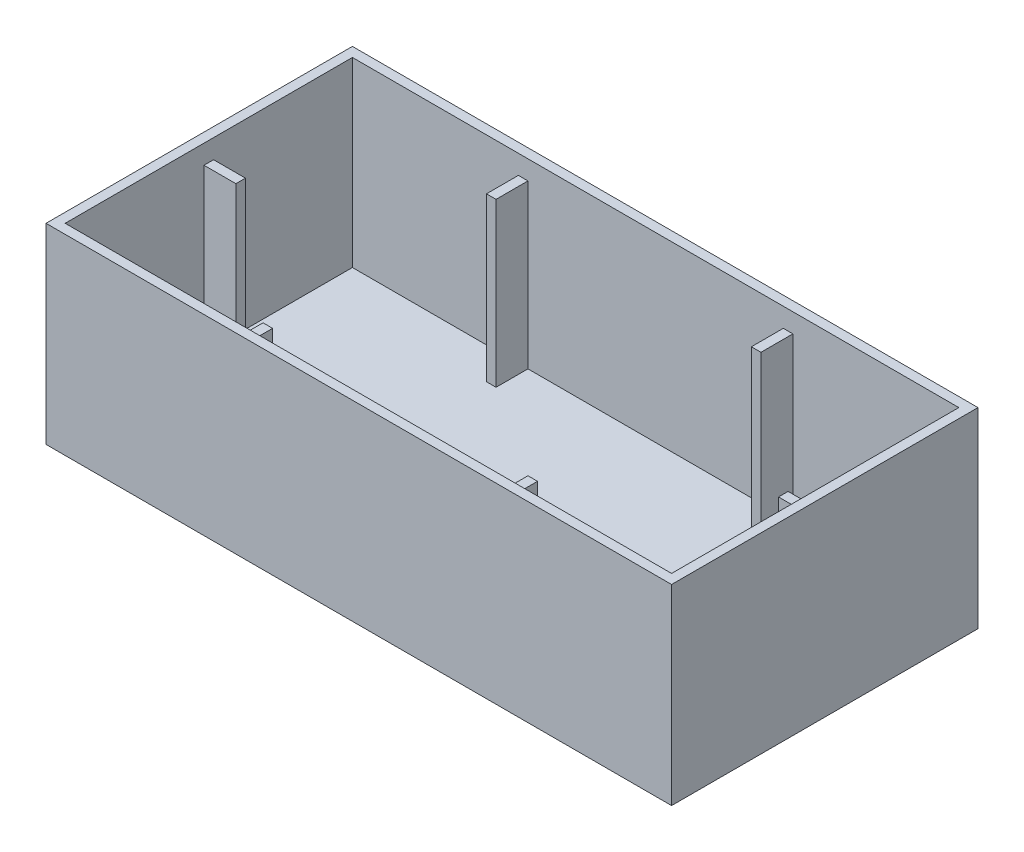
ISO-10303-21;
HEADER;
FILE_DESCRIPTION(('STEP AP214'),'2;1');
FILE_NAME('part.step','',(''),(''),'','','');
FILE_SCHEMA(('AUTOMOTIVE_DESIGN { 1 0 10303 214 1 1 1 1 }'));
ENDSEC;
DATA;
#1=APPLICATION_CONTEXT('core data for automotive mechanical design processes');
#2=APPLICATION_PROTOCOL_DEFINITION('international standard','automotive_design',2000,#1);
#3=PRODUCT_CONTEXT('',#1,'mechanical');
#4=PRODUCT('Part','Part','',(#3));
#5=PRODUCT_RELATED_PRODUCT_CATEGORY('part','',(#4));
#6=PRODUCT_DEFINITION_FORMATION('','',#4);
#7=PRODUCT_DEFINITION_CONTEXT('part definition',#1,'design');
#8=PRODUCT_DEFINITION('design','',#6,#7);
#9=PRODUCT_DEFINITION_SHAPE('','',#8);
#10=(LENGTH_UNIT() NAMED_UNIT(*) SI_UNIT(.MILLI.,.METRE.));
#11=(NAMED_UNIT(*) PLANE_ANGLE_UNIT() SI_UNIT($,.RADIAN.));
#12=(NAMED_UNIT(*) SI_UNIT($,.STERADIAN.) SOLID_ANGLE_UNIT());
#13=UNCERTAINTY_MEASURE_WITH_UNIT(LENGTH_MEASURE(1.E-05),#10,'distance_accuracy_value','');
#14=(GEOMETRIC_REPRESENTATION_CONTEXT(3) GLOBAL_UNCERTAINTY_ASSIGNED_CONTEXT((#13)) GLOBAL_UNIT_ASSIGNED_CONTEXT((#10,
#11,#12)) REPRESENTATION_CONTEXT('',''));
#15=CARTESIAN_POINT('',(0.,0.,0.));
#16=DIRECTION('',(0.,0.,1.));
#17=DIRECTION('',(1.,0.,0.));
#18=AXIS2_PLACEMENT_3D('',#15,#16,#17);
#19=CARTESIAN_POINT('',(0.,1.5,0.));
#20=DIRECTION('',(0.,-1.,0.));
#21=DIRECTION('',(0.,0.,-1.));
#22=AXIS2_PLACEMENT_3D('',#19,#20,#21);
#23=PLANE('',#22);
#24=DIRECTION('',(-1.,0.,0.));
#25=VECTOR('',#24,1.);
#26=CARTESIAN_POINT('',(-47.5,1.5,-0.750000000000003));
#27=LINE('',#26,#25);
#28=CARTESIAN_POINT('',(-42.5,1.5,-0.74999999999999));
#29=VERTEX_POINT('',#28);
#30=CARTESIAN_POINT('',(-47.5,1.5,-0.750000000000003));
#31=VERTEX_POINT('',#30);
#32=EDGE_CURVE('E806',#29,#31,#27,.T.);
#33=ORIENTED_EDGE('',*,*,#32,.F.);
#34=DIRECTION('',(0.,0.,-1.));
#35=VECTOR('',#34,1.);
#36=CARTESIAN_POINT('',(-42.5,1.5,-0.74999999999999));
#37=LINE('',#36,#35);
#38=CARTESIAN_POINT('',(-42.5,1.5,0.75000000000001));
#39=VERTEX_POINT('',#38);
#40=EDGE_CURVE('E266',#39,#29,#37,.T.);
#41=ORIENTED_EDGE('',*,*,#40,.F.);
#42=DIRECTION('',(1.,0.,0.));
#43=VECTOR('',#42,1.);
#44=CARTESIAN_POINT('',(-47.5,1.5,0.750000000000019));
#45=LINE('',#44,#43);
#46=CARTESIAN_POINT('',(-47.5,1.5,0.750000000000019));
#47=VERTEX_POINT('',#46);
#48=EDGE_CURVE('E251',#47,#39,#45,.T.);
#49=ORIENTED_EDGE('',*,*,#48,.F.);
#50=DIRECTION('',(0.,0.,1.));
#51=VECTOR('',#50,1.);
#52=CARTESIAN_POINT('',(-47.5,1.5,0.));
#53=LINE('',#52,#51);
#54=CARTESIAN_POINT('',(-47.5,1.5,22.5));
#55=VERTEX_POINT('',#54);
#56=EDGE_CURVE('E263',#47,#55,#53,.T.);
#57=ORIENTED_EDGE('',*,*,#56,.T.);
#58=DIRECTION('',(1.,0.,0.));
#59=VECTOR('',#58,1.);
#60=CARTESIAN_POINT('',(0.,1.5,22.5));
#61=LINE('',#60,#59);
#62=CARTESIAN_POINT('',(-21.5,1.5,22.5));
#63=VERTEX_POINT('',#62);
#64=EDGE_CURVE('E285',#55,#63,#61,.T.);
#65=ORIENTED_EDGE('',*,*,#64,.T.);
#66=DIRECTION('',(0.,0.,1.));
#67=VECTOR('',#66,1.);
#68=CARTESIAN_POINT('',(-21.5,1.5,22.5));
#69=LINE('',#68,#67);
#70=CARTESIAN_POINT('',(-21.5,1.5,17.5));
#71=VERTEX_POINT('',#70);
#72=EDGE_CURVE('E858',#71,#63,#69,.T.);
#73=ORIENTED_EDGE('',*,*,#72,.F.);
#74=DIRECTION('',(-1.,0.,0.));
#75=VECTOR('',#74,1.);
#76=CARTESIAN_POINT('',(-21.5,1.5,17.5));
#77=LINE('',#76,#75);
#78=CARTESIAN_POINT('',(-20.,1.5,17.5));
#79=VERTEX_POINT('',#78);
#80=EDGE_CURVE('E855',#79,#71,#77,.T.);
#81=ORIENTED_EDGE('',*,*,#80,.F.);
#82=DIRECTION('',(0.,0.,-1.));
#83=VECTOR('',#82,1.);
#84=CARTESIAN_POINT('',(-20.,1.5,22.5));
#85=LINE('',#84,#83);
#86=CARTESIAN_POINT('',(-20.,1.5,22.5));
#87=VERTEX_POINT('',#86);
#88=EDGE_CURVE('E756',#87,#79,#85,.T.);
#89=ORIENTED_EDGE('',*,*,#88,.F.);
#90=CARTESIAN_POINT('',(20.,1.5,22.5));
#91=VERTEX_POINT('',#90);
#92=EDGE_CURVE('E288',#87,#91,#61,.T.);
#93=ORIENTED_EDGE('',*,*,#92,.T.);
#94=DIRECTION('',(0.,0.,1.));
#95=VECTOR('',#94,1.);
#96=CARTESIAN_POINT('',(20.,1.5,22.5));
#97=LINE('',#96,#95);
#98=CARTESIAN_POINT('',(20.,1.5,17.5));
#99=VERTEX_POINT('',#98);
#100=EDGE_CURVE('E753',#99,#91,#97,.T.);
#101=ORIENTED_EDGE('',*,*,#100,.F.);
#102=DIRECTION('',(-1.,0.,0.));
#103=VECTOR('',#102,1.);
#104=CARTESIAN_POINT('',(21.5,1.5,17.5));
#105=LINE('',#104,#103);
#106=CARTESIAN_POINT('',(21.5,1.5,17.5));
#107=VERTEX_POINT('',#106);
#108=EDGE_CURVE('E765',#107,#99,#105,.T.);
#109=ORIENTED_EDGE('',*,*,#108,.F.);
#110=DIRECTION('',(0.,0.,-1.));
#111=VECTOR('',#110,1.);
#112=CARTESIAN_POINT('',(21.5,1.5,22.5));
#113=LINE('',#112,#111);
#114=CARTESIAN_POINT('',(21.5,1.5,22.5));
#115=VERTEX_POINT('',#114);
#116=EDGE_CURVE('E748',#115,#107,#113,.T.);
#117=ORIENTED_EDGE('',*,*,#116,.F.);
#118=CARTESIAN_POINT('',(47.5,1.5,22.5));
#119=VERTEX_POINT('',#118);
#120=EDGE_CURVE('E276',#115,#119,#61,.T.);
#121=ORIENTED_EDGE('',*,*,#120,.T.);
#122=DIRECTION('',(0.,0.,-1.));
#123=VECTOR('',#122,1.);
#124=CARTESIAN_POINT('',(47.5,1.5,0.));
#125=LINE('',#124,#123);
#126=CARTESIAN_POINT('',(47.5,1.5,0.750000000000019));
#127=VERTEX_POINT('',#126);
#128=EDGE_CURVE('E728',#119,#127,#125,.T.);
#129=ORIENTED_EDGE('',*,*,#128,.T.);
#130=DIRECTION('',(1.,0.,0.));
#131=VECTOR('',#130,1.);
#132=CARTESIAN_POINT('',(47.5,1.5,0.750000000000019));
#133=LINE('',#132,#131);
#134=CARTESIAN_POINT('',(42.5,1.5,0.75000000000001));
#135=VERTEX_POINT('',#134);
#136=EDGE_CURVE('E744',#135,#127,#133,.T.);
#137=ORIENTED_EDGE('',*,*,#136,.F.);
#138=DIRECTION('',(0.,0.,1.));
#139=VECTOR('',#138,1.);
#140=CARTESIAN_POINT('',(42.5,1.5,-0.74999999999999));
#141=LINE('',#140,#139);
#142=CARTESIAN_POINT('',(42.5,1.5,-0.74999999999999));
#143=VERTEX_POINT('',#142);
#144=EDGE_CURVE('E832',#143,#135,#141,.T.);
#145=ORIENTED_EDGE('',*,*,#144,.F.);
#146=DIRECTION('',(-1.,0.,0.));
#147=VECTOR('',#146,1.);
#148=CARTESIAN_POINT('',(47.5,1.5,-0.750000000000003));
#149=LINE('',#148,#147);
#150=CARTESIAN_POINT('',(47.5,1.5,-0.750000000000003));
#151=VERTEX_POINT('',#150);
#152=EDGE_CURVE('E829',#151,#143,#149,.T.);
#153=ORIENTED_EDGE('',*,*,#152,.F.);
#154=CARTESIAN_POINT('',(47.5,1.5,-22.5));
#155=VERTEX_POINT('',#154);
#156=EDGE_CURVE('E707',#151,#155,#125,.T.);
#157=ORIENTED_EDGE('',*,*,#156,.T.);
#158=DIRECTION('',(-1.,0.,0.));
#159=VECTOR('',#158,1.);
#160=CARTESIAN_POINT('',(0.,1.5,-22.5));
#161=LINE('',#160,#159);
#162=CARTESIAN_POINT('',(21.5,1.5,-22.5));
#163=VERTEX_POINT('',#162);
#164=EDGE_CURVE('E273',#155,#163,#161,.T.);
#165=ORIENTED_EDGE('',*,*,#164,.T.);
#166=DIRECTION('',(0.,0.,-1.));
#167=VECTOR('',#166,1.);
#168=CARTESIAN_POINT('',(21.5,1.5,-22.5));
#169=LINE('',#168,#167);
#170=CARTESIAN_POINT('',(21.5,1.5,-17.5));
#171=VERTEX_POINT('',#170);
#172=EDGE_CURVE('E785',#171,#163,#169,.T.);
#173=ORIENTED_EDGE('',*,*,#172,.F.);
#174=DIRECTION('',(1.,0.,0.));
#175=VECTOR('',#174,1.);
#176=CARTESIAN_POINT('',(21.5,1.5,-17.5));
#177=LINE('',#176,#175);
#178=CARTESIAN_POINT('',(20.,1.5,-17.5));
#179=VERTEX_POINT('',#178);
#180=EDGE_CURVE('E789',#179,#171,#177,.T.);
#181=ORIENTED_EDGE('',*,*,#180,.F.);
#182=DIRECTION('',(0.,0.,1.));
#183=VECTOR('',#182,1.);
#184=CARTESIAN_POINT('',(20.,1.5,-22.5));
#185=LINE('',#184,#183);
#186=CARTESIAN_POINT('',(20.,1.5,-22.5));
#187=VERTEX_POINT('',#186);
#188=EDGE_CURVE('E682',#187,#179,#185,.T.);
#189=ORIENTED_EDGE('',*,*,#188,.F.);
#190=CARTESIAN_POINT('',(-20.,1.5,-22.5));
#191=VERTEX_POINT('',#190);
#192=EDGE_CURVE('E277',#187,#191,#161,.T.);
#193=ORIENTED_EDGE('',*,*,#192,.T.);
#194=DIRECTION('',(0.,0.,-1.));
#195=VECTOR('',#194,1.);
#196=CARTESIAN_POINT('',(-20.,1.5,-22.5));
#197=LINE('',#196,#195);
#198=CARTESIAN_POINT('',(-20.,1.5,-17.5));
#199=VERTEX_POINT('',#198);
#200=EDGE_CURVE('E715',#199,#191,#197,.T.);
#201=ORIENTED_EDGE('',*,*,#200,.F.);
#202=DIRECTION('',(1.,0.,0.));
#203=VECTOR('',#202,1.);
#204=CARTESIAN_POINT('',(-21.5,1.5,-17.5));
#205=LINE('',#204,#203);
#206=CARTESIAN_POINT('',(-21.5,1.5,-17.5));
#207=VERTEX_POINT('',#206);
#208=EDGE_CURVE('E711',#207,#199,#205,.T.);
#209=ORIENTED_EDGE('',*,*,#208,.F.);
#210=DIRECTION('',(0.,0.,1.));
#211=VECTOR('',#210,1.);
#212=CARTESIAN_POINT('',(-21.5,1.5,-22.5));
#213=LINE('',#212,#211);
#214=CARTESIAN_POINT('',(-21.5,1.5,-22.5));
#215=VERTEX_POINT('',#214);
#216=EDGE_CURVE('E708',#215,#207,#213,.T.);
#217=ORIENTED_EDGE('',*,*,#216,.F.);
#218=CARTESIAN_POINT('',(-47.5,1.5,-22.5));
#219=VERTEX_POINT('',#218);
#220=EDGE_CURVE('E279',#215,#219,#161,.T.);
#221=ORIENTED_EDGE('',*,*,#220,.T.);
#222=EDGE_CURVE('E272',#219,#31,#53,.T.);
#223=ORIENTED_EDGE('',*,*,#222,.T.);
#224=EDGE_LOOP('',(#33,#41,#49,#57,#65,#73,#81,#89,#93,#101,#109,#117,#121,#129,#137,#145,#153,
#157,#165,#173,#181,#189,#193,#201,#209,#217,#221,#223));
#225=FACE_BOUND('',#224,.T.);
#226=ADVANCED_FACE('F35',(#225),#23,.F.);
#227=CARTESIAN_POINT('',(-47.5,30.,24.));
#228=DIRECTION('',(1.,0.,0.));
#229=DIRECTION('',(0.,0.,-1.));
#230=AXIS2_PLACEMENT_3D('',#227,#228,#229);
#231=PLANE('',#230);
#232=DIRECTION('',(0.,0.,-1.));
#233=VECTOR('',#232,1.);
#234=CARTESIAN_POINT('',(-47.5,27.,-0.750000000000003));
#235=LINE('',#234,#233);
#236=CARTESIAN_POINT('',(-47.5,27.,0.750000000000019));
#237=VERTEX_POINT('',#236);
#238=CARTESIAN_POINT('',(-47.5,27.,-0.750000000000001));
#239=VERTEX_POINT('',#238);
#240=EDGE_CURVE('E833',#237,#239,#235,.T.);
#241=ORIENTED_EDGE('',*,*,#240,.T.);
#242=DIRECTION('',(0.,-1.,0.));
#243=VECTOR('',#242,1.);
#244=CARTESIAN_POINT('',(-47.5,35.2201532544553,-0.750000000000003));
#245=LINE('',#244,#243);
#246=EDGE_CURVE('E50',#239,#31,#245,.T.);
#247=ORIENTED_EDGE('',*,*,#246,.T.);
#248=ORIENTED_EDGE('',*,*,#222,.F.);
#249=DIRECTION('',(0.,-1.,0.));
#250=VECTOR('',#249,1.);
#251=CARTESIAN_POINT('',(-47.5,30.,-22.5));
#252=LINE('',#251,#250);
#253=CARTESIAN_POINT('',(-47.5,30.,-22.5));
#254=VERTEX_POINT('',#253);
#255=EDGE_CURVE('E282',#254,#219,#252,.T.);
#256=ORIENTED_EDGE('',*,*,#255,.F.);
#257=DIRECTION('',(0.,0.,1.));
#258=VECTOR('',#257,1.);
#259=CARTESIAN_POINT('',(-47.5,30.,0.));
#260=LINE('',#259,#258);
#261=CARTESIAN_POINT('',(-47.5,30.,22.5));
#262=VERTEX_POINT('',#261);
#263=EDGE_CURVE('E292',#254,#262,#260,.T.);
#264=ORIENTED_EDGE('',*,*,#263,.T.);
#265=DIRECTION('',(0.,-1.,0.));
#266=VECTOR('',#265,1.);
#267=CARTESIAN_POINT('',(-47.5,30.,22.5));
#268=LINE('',#267,#266);
#269=EDGE_CURVE('E270',#262,#55,#268,.T.);
#270=ORIENTED_EDGE('',*,*,#269,.T.);
#271=ORIENTED_EDGE('',*,*,#56,.F.);
#272=DIRECTION('',(0.,-1.,0.));
#273=VECTOR('',#272,1.);
#274=CARTESIAN_POINT('',(-47.5,35.2201532544553,0.750000000000019));
#275=LINE('',#274,#273);
#276=EDGE_CURVE('E247',#237,#47,#275,.T.);
#277=ORIENTED_EDGE('',*,*,#276,.F.);
#278=EDGE_LOOP('',(#241,#247,#248,#256,#264,#270,#271,#277));
#279=FACE_BOUND('',#278,.T.);
#280=ADVANCED_FACE('F268',(#279),#231,.T.);
#281=CARTESIAN_POINT('',(47.5,30.,24.));
#282=DIRECTION('',(-1.,0.,0.));
#283=DIRECTION('',(0.,0.,1.));
#284=AXIS2_PLACEMENT_3D('',#281,#282,#283);
#285=PLANE('',#284);
#286=DIRECTION('',(0.,0.,1.));
#287=VECTOR('',#286,1.);
#288=CARTESIAN_POINT('',(47.5,27.,-0.750000000000003));
#289=LINE('',#288,#287);
#290=CARTESIAN_POINT('',(47.5,27.,-0.750000000000003));
#291=VERTEX_POINT('',#290);
#292=CARTESIAN_POINT('',(47.5,27.,0.750000000000018));
#293=VERTEX_POINT('',#292);
#294=EDGE_CURVE('E823',#291,#293,#289,.T.);
#295=ORIENTED_EDGE('',*,*,#294,.T.);
#296=DIRECTION('',(0.,-1.,0.));
#297=VECTOR('',#296,1.);
#298=CARTESIAN_POINT('',(47.5,35.2201532544553,0.750000000000019));
#299=LINE('',#298,#297);
#300=EDGE_CURVE('E58',#293,#127,#299,.T.);
#301=ORIENTED_EDGE('',*,*,#300,.T.);
#302=ORIENTED_EDGE('',*,*,#128,.F.);
#303=DIRECTION('',(0.,-1.,0.));
#304=VECTOR('',#303,1.);
#305=CARTESIAN_POINT('',(47.5,30.,22.5));
#306=LINE('',#305,#304);
#307=CARTESIAN_POINT('',(47.5,30.,22.5));
#308=VERTEX_POINT('',#307);
#309=EDGE_CURVE('E284',#308,#119,#306,.T.);
#310=ORIENTED_EDGE('',*,*,#309,.F.);
#311=DIRECTION('',(0.,0.,-1.));
#312=VECTOR('',#311,1.);
#313=CARTESIAN_POINT('',(47.5,30.,0.));
#314=LINE('',#313,#312);
#315=CARTESIAN_POINT('',(47.5,30.,-22.5));
#316=VERTEX_POINT('',#315);
#317=EDGE_CURVE('E287',#308,#316,#314,.T.);
#318=ORIENTED_EDGE('',*,*,#317,.T.);
#319=DIRECTION('',(0.,-1.,0.));
#320=VECTOR('',#319,1.);
#321=CARTESIAN_POINT('',(47.5,30.,-22.5));
#322=LINE('',#321,#320);
#323=EDGE_CURVE('E311',#316,#155,#322,.T.);
#324=ORIENTED_EDGE('',*,*,#323,.T.);
#325=ORIENTED_EDGE('',*,*,#156,.F.);
#326=DIRECTION('',(0.,-1.,0.));
#327=VECTOR('',#326,1.);
#328=CARTESIAN_POINT('',(47.5,35.2201532544553,-0.750000000000003));
#329=LINE('',#328,#327);
#330=EDGE_CURVE('E837',#291,#151,#329,.T.);
#331=ORIENTED_EDGE('',*,*,#330,.F.);
#332=EDGE_LOOP('',(#295,#301,#302,#310,#318,#324,#325,#331));
#333=FACE_BOUND('',#332,.T.);
#334=ADVANCED_FACE('F354',(#333),#285,.T.);
#335=CARTESIAN_POINT('',(-49.,30.,22.5));
#336=DIRECTION('',(0.,0.,-1.));
#337=DIRECTION('',(-1.,0.,0.));
#338=AXIS2_PLACEMENT_3D('',#335,#336,#337);
#339=PLANE('',#338);
#340=DIRECTION('',(-1.,0.,0.));
#341=VECTOR('',#340,1.);
#342=CARTESIAN_POINT('',(-21.5,27.,22.5));
#343=LINE('',#342,#341);
#344=CARTESIAN_POINT('',(-20.,27.,22.5));
#345=VERTEX_POINT('',#344);
#346=CARTESIAN_POINT('',(-21.5,27.,22.5));
#347=VERTEX_POINT('',#346);
#348=EDGE_CURVE('E852',#345,#347,#343,.T.);
#349=ORIENTED_EDGE('',*,*,#348,.T.);
#350=DIRECTION('',(0.,-1.,0.));
#351=VECTOR('',#350,1.);
#352=CARTESIAN_POINT('',(-21.5,35.2201532544553,22.5));
#353=LINE('',#352,#351);
#354=EDGE_CURVE('E860',#347,#63,#353,.T.);
#355=ORIENTED_EDGE('',*,*,#354,.T.);
#356=ORIENTED_EDGE('',*,*,#64,.F.);
#357=ORIENTED_EDGE('',*,*,#269,.F.);
#358=DIRECTION('',(1.,0.,0.));
#359=VECTOR('',#358,1.);
#360=CARTESIAN_POINT('',(0.,30.,22.5));
#361=LINE('',#360,#359);
#362=EDGE_CURVE('E294',#262,#308,#361,.T.);
#363=ORIENTED_EDGE('',*,*,#362,.T.);
#364=ORIENTED_EDGE('',*,*,#309,.T.);
#365=ORIENTED_EDGE('',*,*,#120,.F.);
#366=DIRECTION('',(0.,-1.,0.));
#367=VECTOR('',#366,1.);
#368=CARTESIAN_POINT('',(21.5,35.2201532544553,22.5));
#369=LINE('',#368,#367);
#370=CARTESIAN_POINT('',(21.5,27.,22.5));
#371=VERTEX_POINT('',#370);
#372=EDGE_CURVE('E775',#371,#115,#369,.T.);
#373=ORIENTED_EDGE('',*,*,#372,.F.);
#374=DIRECTION('',(-1.,0.,0.));
#375=VECTOR('',#374,1.);
#376=CARTESIAN_POINT('',(21.5,27.,22.5));
#377=LINE('',#376,#375);
#378=CARTESIAN_POINT('',(20.,27.,22.5));
#379=VERTEX_POINT('',#378);
#380=EDGE_CURVE('E768',#371,#379,#377,.T.);
#381=ORIENTED_EDGE('',*,*,#380,.T.);
#382=DIRECTION('',(0.,-1.,0.));
#383=VECTOR('',#382,1.);
#384=CARTESIAN_POINT('',(20.,35.2201532544553,22.5));
#385=LINE('',#384,#383);
#386=EDGE_CURVE('E760',#379,#91,#385,.T.);
#387=ORIENTED_EDGE('',*,*,#386,.T.);
#388=ORIENTED_EDGE('',*,*,#92,.F.);
#389=DIRECTION('',(0.,-1.,0.));
#390=VECTOR('',#389,1.);
#391=CARTESIAN_POINT('',(-20.,35.2201532544553,22.5));
#392=LINE('',#391,#390);
#393=EDGE_CURVE('E867',#345,#87,#392,.T.);
#394=ORIENTED_EDGE('',*,*,#393,.F.);
#395=EDGE_LOOP('',(#349,#355,#356,#357,#363,#364,#365,#373,#381,#387,#388,#394));
#396=FACE_BOUND('',#395,.T.);
#397=ADVANCED_FACE('F358',(#396),#339,.T.);
#398=CARTESIAN_POINT('',(-49.,30.,-22.5));
#399=DIRECTION('',(0.,0.,1.));
#400=DIRECTION('',(1.,0.,0.));
#401=AXIS2_PLACEMENT_3D('',#398,#399,#400);
#402=PLANE('',#401);
#403=ORIENTED_EDGE('',*,*,#192,.F.);
#404=DIRECTION('',(0.,-1.,0.));
#405=VECTOR('',#404,1.);
#406=CARTESIAN_POINT('',(20.,35.2201532544553,-22.5));
#407=LINE('',#406,#405);
#408=CARTESIAN_POINT('',(20.,27.,-22.5));
#409=VERTEX_POINT('',#408);
#410=EDGE_CURVE('E674',#409,#187,#407,.T.);
#411=ORIENTED_EDGE('',*,*,#410,.F.);
#412=DIRECTION('',(1.,0.,0.));
#413=VECTOR('',#412,1.);
#414=CARTESIAN_POINT('',(21.5,27.,-22.5));
#415=LINE('',#414,#413);
#416=CARTESIAN_POINT('',(21.5,27.,-22.5));
#417=VERTEX_POINT('',#416);
#418=EDGE_CURVE('E781',#409,#417,#415,.T.);
#419=ORIENTED_EDGE('',*,*,#418,.T.);
#420=DIRECTION('',(0.,-1.,0.));
#421=VECTOR('',#420,1.);
#422=CARTESIAN_POINT('',(21.5,35.2201532544553,-22.5));
#423=LINE('',#422,#421);
#424=EDGE_CURVE('E684',#417,#163,#423,.T.);
#425=ORIENTED_EDGE('',*,*,#424,.T.);
#426=ORIENTED_EDGE('',*,*,#164,.F.);
#427=ORIENTED_EDGE('',*,*,#323,.F.);
#428=DIRECTION('',(-1.,0.,0.));
#429=VECTOR('',#428,1.);
#430=CARTESIAN_POINT('',(0.,30.,-22.5));
#431=LINE('',#430,#429);
#432=EDGE_CURVE('E290',#316,#254,#431,.T.);
#433=ORIENTED_EDGE('',*,*,#432,.T.);
#434=ORIENTED_EDGE('',*,*,#255,.T.);
#435=ORIENTED_EDGE('',*,*,#220,.F.);
#436=DIRECTION('',(0.,-1.,0.));
#437=VECTOR('',#436,1.);
#438=CARTESIAN_POINT('',(-21.5,35.2201532544553,-22.5));
#439=LINE('',#438,#437);
#440=CARTESIAN_POINT('',(-21.5,27.,-22.5));
#441=VERTEX_POINT('',#440);
#442=EDGE_CURVE('E717',#441,#215,#439,.T.);
#443=ORIENTED_EDGE('',*,*,#442,.F.);
#444=DIRECTION('',(1.,0.,0.));
#445=VECTOR('',#444,1.);
#446=CARTESIAN_POINT('',(-21.5,27.,-22.5));
#447=LINE('',#446,#445);
#448=CARTESIAN_POINT('',(-20.,27.,-22.5));
#449=VERTEX_POINT('',#448);
#450=EDGE_CURVE('E701',#441,#449,#447,.T.);
#451=ORIENTED_EDGE('',*,*,#450,.T.);
#452=DIRECTION('',(0.,-1.,0.));
#453=VECTOR('',#452,1.);
#454=CARTESIAN_POINT('',(-20.,35.2201532544553,-22.5));
#455=LINE('',#454,#453);
#456=EDGE_CURVE('E677',#449,#191,#455,.T.);
#457=ORIENTED_EDGE('',*,*,#456,.T.);
#458=EDGE_LOOP('',(#403,#411,#419,#425,#426,#427,#433,#434,#435,#443,#451,#457));
#459=FACE_BOUND('',#458,.T.);
#460=ADVANCED_FACE('F361',(#459),#402,.T.);
#461=CARTESIAN_POINT('',(0.,30.,0.));
#462=DIRECTION('',(0.,-1.,0.));
#463=DIRECTION('',(0.,0.,-1.));
#464=AXIS2_PLACEMENT_3D('',#461,#462,#463);
#465=PLANE('',#464);
#466=DIRECTION('',(0.,0.,-1.));
#467=VECTOR('',#466,1.);
#468=CARTESIAN_POINT('',(49.,30.,24.));
#469=LINE('',#468,#467);
#470=CARTESIAN_POINT('',(49.,30.,24.));
#471=VERTEX_POINT('',#470);
#472=CARTESIAN_POINT('',(49.,30.,-24.));
#473=VERTEX_POINT('',#472);
#474=EDGE_CURVE('E296',#471,#473,#469,.T.);
#475=ORIENTED_EDGE('',*,*,#474,.T.);
#476=DIRECTION('',(-1.,0.,0.));
#477=VECTOR('',#476,1.);
#478=CARTESIAN_POINT('',(-49.,30.,-24.));
#479=LINE('',#478,#477);
#480=CARTESIAN_POINT('',(-49.,30.,-24.));
#481=VERTEX_POINT('',#480);
#482=EDGE_CURVE('E299',#473,#481,#479,.T.);
#483=ORIENTED_EDGE('',*,*,#482,.T.);
#484=DIRECTION('',(0.,0.,1.));
#485=VECTOR('',#484,1.);
#486=CARTESIAN_POINT('',(-49.,30.,24.));
#487=LINE('',#486,#485);
#488=CARTESIAN_POINT('',(-49.,30.,24.));
#489=VERTEX_POINT('',#488);
#490=EDGE_CURVE('E302',#481,#489,#487,.T.);
#491=ORIENTED_EDGE('',*,*,#490,.T.);
#492=DIRECTION('',(1.,0.,0.));
#493=VECTOR('',#492,1.);
#494=CARTESIAN_POINT('',(-49.,30.,24.));
#495=LINE('',#494,#493);
#496=EDGE_CURVE('E304',#489,#471,#495,.T.);
#497=ORIENTED_EDGE('',*,*,#496,.T.);
#498=EDGE_LOOP('',(#475,#483,#491,#497));
#499=FACE_BOUND('',#498,.T.);
#500=ORIENTED_EDGE('',*,*,#317,.F.);
#501=ORIENTED_EDGE('',*,*,#362,.F.);
#502=ORIENTED_EDGE('',*,*,#263,.F.);
#503=ORIENTED_EDGE('',*,*,#432,.F.);
#504=EDGE_LOOP('',(#500,#501,#502,#503));
#505=FACE_BOUND('',#504,.T.);
#506=ADVANCED_FACE('F340',(#499,#505),#465,.F.);
#507=CARTESIAN_POINT('',(49.,30.,24.));
#508=DIRECTION('',(-1.,0.,0.));
#509=DIRECTION('',(0.,0.,1.));
#510=AXIS2_PLACEMENT_3D('',#507,#508,#509);
#511=PLANE('',#510);
#512=DIRECTION('',(0.,0.,-1.));
#513=VECTOR('',#512,1.);
#514=CARTESIAN_POINT('',(49.,0.,24.));
#515=LINE('',#514,#513);
#516=CARTESIAN_POINT('',(49.,0.,24.));
#517=VERTEX_POINT('',#516);
#518=CARTESIAN_POINT('',(49.,0.,-24.));
#519=VERTEX_POINT('',#518);
#520=EDGE_CURVE('E307',#517,#519,#515,.T.);
#521=ORIENTED_EDGE('',*,*,#520,.T.);
#522=DIRECTION('',(0.,-1.,0.));
#523=VECTOR('',#522,1.);
#524=CARTESIAN_POINT('',(49.,30.,-24.));
#525=LINE('',#524,#523);
#526=EDGE_CURVE('E12',#473,#519,#525,.T.);
#527=ORIENTED_EDGE('',*,*,#526,.F.);
#528=ORIENTED_EDGE('',*,*,#474,.F.);
#529=DIRECTION('',(0.,-1.,0.));
#530=VECTOR('',#529,1.);
#531=CARTESIAN_POINT('',(49.,30.,24.));
#532=LINE('',#531,#530);
#533=EDGE_CURVE('E306',#471,#517,#532,.T.);
#534=ORIENTED_EDGE('',*,*,#533,.T.);
#535=EDGE_LOOP('',(#521,#527,#528,#534));
#536=FACE_BOUND('',#535,.T.);
#537=ADVANCED_FACE('F37',(#536),#511,.F.);
#538=CARTESIAN_POINT('',(-49.,30.,-24.));
#539=DIRECTION('',(0.,0.,1.));
#540=DIRECTION('',(1.,0.,0.));
#541=AXIS2_PLACEMENT_3D('',#538,#539,#540);
#542=PLANE('',#541);
#543=DIRECTION('',(-1.,0.,0.));
#544=VECTOR('',#543,1.);
#545=CARTESIAN_POINT('',(-49.,0.,-24.));
#546=LINE('',#545,#544);
#547=CARTESIAN_POINT('',(-49.,0.,-24.));
#548=VERTEX_POINT('',#547);
#549=EDGE_CURVE('E310',#519,#548,#546,.T.);
#550=ORIENTED_EDGE('',*,*,#549,.T.);
#551=DIRECTION('',(0.,-1.,0.));
#552=VECTOR('',#551,1.);
#553=CARTESIAN_POINT('',(-49.,30.,-24.));
#554=LINE('',#553,#552);
#555=EDGE_CURVE('E43',#481,#548,#554,.T.);
#556=ORIENTED_EDGE('',*,*,#555,.F.);
#557=ORIENTED_EDGE('',*,*,#482,.F.);
#558=ORIENTED_EDGE('',*,*,#526,.T.);
#559=EDGE_LOOP('',(#550,#556,#557,#558));
#560=FACE_BOUND('',#559,.T.);
#561=ADVANCED_FACE('F342',(#560),#542,.F.);
#562=CARTESIAN_POINT('',(-49.,30.,24.));
#563=DIRECTION('',(1.,0.,0.));
#564=DIRECTION('',(0.,0.,-1.));
#565=AXIS2_PLACEMENT_3D('',#562,#563,#564);
#566=PLANE('',#565);
#567=DIRECTION('',(0.,0.,1.));
#568=VECTOR('',#567,1.);
#569=CARTESIAN_POINT('',(-49.,0.,24.));
#570=LINE('',#569,#568);
#571=CARTESIAN_POINT('',(-49.,0.,24.));
#572=VERTEX_POINT('',#571);
#573=EDGE_CURVE('E313',#548,#572,#570,.T.);
#574=ORIENTED_EDGE('',*,*,#573,.T.);
#575=DIRECTION('',(0.,-1.,0.));
#576=VECTOR('',#575,1.);
#577=CARTESIAN_POINT('',(-49.,30.,24.));
#578=LINE('',#577,#576);
#579=EDGE_CURVE('E318',#489,#572,#578,.T.);
#580=ORIENTED_EDGE('',*,*,#579,.F.);
#581=ORIENTED_EDGE('',*,*,#490,.F.);
#582=ORIENTED_EDGE('',*,*,#555,.T.);
#583=EDGE_LOOP('',(#574,#580,#581,#582));
#584=FACE_BOUND('',#583,.T.);
#585=ADVANCED_FACE('F325',(#584),#566,.F.);
#586=CARTESIAN_POINT('',(-49.,30.,24.));
#587=DIRECTION('',(0.,0.,-1.));
#588=DIRECTION('',(-1.,0.,0.));
#589=AXIS2_PLACEMENT_3D('',#586,#587,#588);
#590=PLANE('',#589);
#591=DIRECTION('',(1.,0.,0.));
#592=VECTOR('',#591,1.);
#593=CARTESIAN_POINT('',(-49.,0.,24.));
#594=LINE('',#593,#592);
#595=EDGE_CURVE('E300',#572,#517,#594,.T.);
#596=ORIENTED_EDGE('',*,*,#595,.T.);
#597=ORIENTED_EDGE('',*,*,#533,.F.);
#598=ORIENTED_EDGE('',*,*,#496,.F.);
#599=ORIENTED_EDGE('',*,*,#579,.T.);
#600=EDGE_LOOP('',(#596,#597,#598,#599));
#601=FACE_BOUND('',#600,.T.);
#602=ADVANCED_FACE('F334',(#601),#590,.F.);
#603=CARTESIAN_POINT('',(0.,0.,0.));
#604=DIRECTION('',(0.,-1.,0.));
#605=DIRECTION('',(0.,0.,-1.));
#606=AXIS2_PLACEMENT_3D('',#603,#604,#605);
#607=PLANE('',#606);
#608=ORIENTED_EDGE('',*,*,#520,.F.);
#609=ORIENTED_EDGE('',*,*,#595,.F.);
#610=ORIENTED_EDGE('',*,*,#573,.F.);
#611=ORIENTED_EDGE('',*,*,#549,.F.);
#612=EDGE_LOOP('',(#608,#609,#610,#611));
#613=FACE_BOUND('',#612,.T.);
#614=ADVANCED_FACE('F331',(#613),#607,.T.);
#615=CARTESIAN_POINT('',(-20.,35.2201532544553,-22.5));
#616=DIRECTION('',(-1.,0.,0.));
#617=DIRECTION('',(0.,0.,1.));
#618=AXIS2_PLACEMENT_3D('',#615,#616,#617);
#619=PLANE('',#618);
#620=ORIENTED_EDGE('',*,*,#456,.F.);
#621=DIRECTION('',(0.,0.,1.));
#622=VECTOR('',#621,1.);
#623=CARTESIAN_POINT('',(-20.,27.,-22.5));
#624=LINE('',#623,#622);
#625=CARTESIAN_POINT('',(-20.,27.,-17.5));
#626=VERTEX_POINT('',#625);
#627=EDGE_CURVE('E697',#449,#626,#624,.T.);
#628=ORIENTED_EDGE('',*,*,#627,.T.);
#629=DIRECTION('',(0.,-1.,0.));
#630=VECTOR('',#629,1.);
#631=CARTESIAN_POINT('',(-20.,35.2201532544553,-17.5));
#632=LINE('',#631,#630);
#633=EDGE_CURVE('E721',#626,#199,#632,.T.);
#634=ORIENTED_EDGE('',*,*,#633,.T.);
#635=ORIENTED_EDGE('',*,*,#200,.T.);
#636=EDGE_LOOP('',(#620,#628,#634,#635));
#637=FACE_BOUND('',#636,.T.);
#638=ADVANCED_FACE('F364',(#637),#619,.F.);
#639=CARTESIAN_POINT('',(-21.5,35.2201532544553,-17.5));
#640=DIRECTION('',(0.,0.,-1.));
#641=DIRECTION('',(-1.,0.,0.));
#642=AXIS2_PLACEMENT_3D('',#639,#640,#641);
#643=PLANE('',#642);
#644=ORIENTED_EDGE('',*,*,#633,.F.);
#645=DIRECTION('',(-1.,0.,0.));
#646=VECTOR('',#645,1.);
#647=CARTESIAN_POINT('',(-21.5,27.,-17.5));
#648=LINE('',#647,#646);
#649=CARTESIAN_POINT('',(-21.5,27.,-17.5));
#650=VERTEX_POINT('',#649);
#651=EDGE_CURVE('E700',#626,#650,#648,.T.);
#652=ORIENTED_EDGE('',*,*,#651,.T.);
#653=DIRECTION('',(0.,-1.,0.));
#654=VECTOR('',#653,1.);
#655=CARTESIAN_POINT('',(-21.5,35.2201532544553,-17.5));
#656=LINE('',#655,#654);
#657=EDGE_CURVE('E724',#650,#207,#656,.T.);
#658=ORIENTED_EDGE('',*,*,#657,.T.);
#659=ORIENTED_EDGE('',*,*,#208,.T.);
#660=EDGE_LOOP('',(#644,#652,#658,#659));
#661=FACE_BOUND('',#660,.T.);
#662=ADVANCED_FACE('F381',(#661),#643,.F.);
#663=CARTESIAN_POINT('',(-21.5,35.2201532544553,-22.5));
#664=DIRECTION('',(1.,0.,0.));
#665=DIRECTION('',(0.,0.,-1.));
#666=AXIS2_PLACEMENT_3D('',#663,#664,#665);
#667=PLANE('',#666);
#668=ORIENTED_EDGE('',*,*,#657,.F.);
#669=DIRECTION('',(0.,0.,-1.));
#670=VECTOR('',#669,1.);
#671=CARTESIAN_POINT('',(-21.5,27.,-22.5));
#672=LINE('',#671,#670);
#673=EDGE_CURVE('E704',#650,#441,#672,.T.);
#674=ORIENTED_EDGE('',*,*,#673,.T.);
#675=ORIENTED_EDGE('',*,*,#442,.T.);
#676=ORIENTED_EDGE('',*,*,#216,.T.);
#677=EDGE_LOOP('',(#668,#674,#675,#676));
#678=FACE_BOUND('',#677,.T.);
#679=ADVANCED_FACE('F390',(#678),#667,.F.);
#680=CARTESIAN_POINT('',(0.,27.,0.));
#681=DIRECTION('',(0.,-1.,0.));
#682=DIRECTION('',(0.,0.,-1.));
#683=AXIS2_PLACEMENT_3D('',#680,#681,#682);
#684=PLANE('',#683);
#685=ORIENTED_EDGE('',*,*,#651,.F.);
#686=ORIENTED_EDGE('',*,*,#627,.F.);
#687=ORIENTED_EDGE('',*,*,#450,.F.);
#688=ORIENTED_EDGE('',*,*,#673,.F.);
#689=EDGE_LOOP('',(#685,#686,#687,#688));
#690=FACE_BOUND('',#689,.T.);
#691=ADVANCED_FACE('F398',(#690),#684,.F.);
#692=CARTESIAN_POINT('',(21.5,35.2201532544553,-17.5));
#693=DIRECTION('',(0.,0.,-1.));
#694=DIRECTION('',(-1.,0.,0.));
#695=AXIS2_PLACEMENT_3D('',#692,#693,#694);
#696=PLANE('',#695);
#697=DIRECTION('',(0.,-1.,0.));
#698=VECTOR('',#697,1.);
#699=CARTESIAN_POINT('',(21.5,35.2201532544553,-17.5));
#700=LINE('',#699,#698);
#701=CARTESIAN_POINT('',(21.5,27.,-17.5));
#702=VERTEX_POINT('',#701);
#703=EDGE_CURVE('E691',#702,#171,#700,.T.);
#704=ORIENTED_EDGE('',*,*,#703,.F.);
#705=DIRECTION('',(-1.,0.,0.));
#706=VECTOR('',#705,1.);
#707=CARTESIAN_POINT('',(21.5,27.,-17.5));
#708=LINE('',#707,#706);
#709=CARTESIAN_POINT('',(20.,27.,-17.5));
#710=VERTEX_POINT('',#709);
#711=EDGE_CURVE('E688',#702,#710,#708,.T.);
#712=ORIENTED_EDGE('',*,*,#711,.T.);
#713=DIRECTION('',(0.,-1.,0.));
#714=VECTOR('',#713,1.);
#715=CARTESIAN_POINT('',(20.,35.2201532544553,-17.5));
#716=LINE('',#715,#714);
#717=EDGE_CURVE('E685',#710,#179,#716,.T.);
#718=ORIENTED_EDGE('',*,*,#717,.T.);
#719=ORIENTED_EDGE('',*,*,#180,.T.);
#720=EDGE_LOOP('',(#704,#712,#718,#719));
#721=FACE_BOUND('',#720,.T.);
#722=ADVANCED_FACE('F406',(#721),#696,.F.);
#723=CARTESIAN_POINT('',(20.,35.2201532544553,-22.5));
#724=DIRECTION('',(1.,0.,0.));
#725=DIRECTION('',(0.,0.,-1.));
#726=AXIS2_PLACEMENT_3D('',#723,#724,#725);
#727=PLANE('',#726);
#728=ORIENTED_EDGE('',*,*,#717,.F.);
#729=DIRECTION('',(0.,0.,-1.));
#730=VECTOR('',#729,1.);
#731=CARTESIAN_POINT('',(20.,27.,-22.5));
#732=LINE('',#731,#730);
#733=EDGE_CURVE('E683',#710,#409,#732,.T.);
#734=ORIENTED_EDGE('',*,*,#733,.T.);
#735=ORIENTED_EDGE('',*,*,#410,.T.);
#736=ORIENTED_EDGE('',*,*,#188,.T.);
#737=EDGE_LOOP('',(#728,#734,#735,#736));
#738=FACE_BOUND('',#737,.T.);
#739=ADVANCED_FACE('F414',(#738),#727,.F.);
#740=CARTESIAN_POINT('',(21.5,35.2201532544553,-22.5));
#741=DIRECTION('',(-1.,0.,0.));
#742=DIRECTION('',(0.,0.,1.));
#743=AXIS2_PLACEMENT_3D('',#740,#741,#742);
#744=PLANE('',#743);
#745=ORIENTED_EDGE('',*,*,#424,.F.);
#746=DIRECTION('',(0.,0.,1.));
#747=VECTOR('',#746,1.);
#748=CARTESIAN_POINT('',(21.5,27.,-22.5));
#749=LINE('',#748,#747);
#750=EDGE_CURVE('E712',#417,#702,#749,.T.);
#751=ORIENTED_EDGE('',*,*,#750,.T.);
#752=ORIENTED_EDGE('',*,*,#703,.T.);
#753=ORIENTED_EDGE('',*,*,#172,.T.);
#754=EDGE_LOOP('',(#745,#751,#752,#753));
#755=FACE_BOUND('',#754,.T.);
#756=ADVANCED_FACE('F422',(#755),#744,.F.);
#757=CARTESIAN_POINT('',(0.,27.,0.));
#758=DIRECTION('',(0.,-1.,0.));
#759=DIRECTION('',(0.,0.,-1.));
#760=AXIS2_PLACEMENT_3D('',#757,#758,#759);
#761=PLANE('',#760);
#762=ORIENTED_EDGE('',*,*,#418,.F.);
#763=ORIENTED_EDGE('',*,*,#733,.F.);
#764=ORIENTED_EDGE('',*,*,#711,.F.);
#765=ORIENTED_EDGE('',*,*,#750,.F.);
#766=EDGE_LOOP('',(#762,#763,#764,#765));
#767=FACE_BOUND('',#766,.T.);
#768=ADVANCED_FACE('F430',(#767),#761,.F.);
#769=CARTESIAN_POINT('',(20.,35.2201532544553,22.5));
#770=DIRECTION('',(1.,0.,0.));
#771=DIRECTION('',(0.,0.,-1.));
#772=AXIS2_PLACEMENT_3D('',#769,#770,#771);
#773=PLANE('',#772);
#774=ORIENTED_EDGE('',*,*,#386,.F.);
#775=DIRECTION('',(0.,0.,-1.));
#776=VECTOR('',#775,1.);
#777=CARTESIAN_POINT('',(20.,27.,22.5));
#778=LINE('',#777,#776);
#779=CARTESIAN_POINT('',(20.,27.,17.5));
#780=VERTEX_POINT('',#779);
#781=EDGE_CURVE('E777',#379,#780,#778,.T.);
#782=ORIENTED_EDGE('',*,*,#781,.T.);
#783=DIRECTION('',(0.,-1.,0.));
#784=VECTOR('',#783,1.);
#785=CARTESIAN_POINT('',(20.,35.2201532544553,17.5));
#786=LINE('',#785,#784);
#787=EDGE_CURVE('E763',#780,#99,#786,.T.);
#788=ORIENTED_EDGE('',*,*,#787,.T.);
#789=ORIENTED_EDGE('',*,*,#100,.T.);
#790=EDGE_LOOP('',(#774,#782,#788,#789));
#791=FACE_BOUND('',#790,.T.);
#792=ADVANCED_FACE('F438',(#791),#773,.F.);
#793=CARTESIAN_POINT('',(21.5,35.2201532544553,17.5));
#794=DIRECTION('',(0.,0.,1.));
#795=DIRECTION('',(1.,0.,0.));
#796=AXIS2_PLACEMENT_3D('',#793,#794,#795);
#797=PLANE('',#796);
#798=ORIENTED_EDGE('',*,*,#787,.F.);
#799=DIRECTION('',(1.,0.,0.));
#800=VECTOR('',#799,1.);
#801=CARTESIAN_POINT('',(21.5,27.,17.5));
#802=LINE('',#801,#800);
#803=CARTESIAN_POINT('',(21.5,27.,17.5));
#804=VERTEX_POINT('',#803);
#805=EDGE_CURVE('E779',#780,#804,#802,.T.);
#806=ORIENTED_EDGE('',*,*,#805,.T.);
#807=DIRECTION('',(0.,-1.,0.));
#808=VECTOR('',#807,1.);
#809=CARTESIAN_POINT('',(21.5,35.2201532544553,17.5));
#810=LINE('',#809,#808);
#811=EDGE_CURVE('E770',#804,#107,#810,.T.);
#812=ORIENTED_EDGE('',*,*,#811,.T.);
#813=ORIENTED_EDGE('',*,*,#108,.T.);
#814=EDGE_LOOP('',(#798,#806,#812,#813));
#815=FACE_BOUND('',#814,.T.);
#816=ADVANCED_FACE('F446',(#815),#797,.F.);
#817=CARTESIAN_POINT('',(21.5,35.2201532544553,22.5));
#818=DIRECTION('',(-1.,0.,0.));
#819=DIRECTION('',(0.,0.,1.));
#820=AXIS2_PLACEMENT_3D('',#817,#818,#819);
#821=PLANE('',#820);
#822=ORIENTED_EDGE('',*,*,#811,.F.);
#823=DIRECTION('',(0.,0.,1.));
#824=VECTOR('',#823,1.);
#825=CARTESIAN_POINT('',(21.5,27.,22.5));
#826=LINE('',#825,#824);
#827=EDGE_CURVE('E873',#804,#371,#826,.T.);
#828=ORIENTED_EDGE('',*,*,#827,.T.);
#829=ORIENTED_EDGE('',*,*,#372,.T.);
#830=ORIENTED_EDGE('',*,*,#116,.T.);
#831=EDGE_LOOP('',(#822,#828,#829,#830));
#832=FACE_BOUND('',#831,.T.);
#833=ADVANCED_FACE('F454',(#832),#821,.F.);
#834=CARTESIAN_POINT('',(0.,27.,0.));
#835=DIRECTION('',(0.,-1.,0.));
#836=DIRECTION('',(0.,0.,-1.));
#837=AXIS2_PLACEMENT_3D('',#834,#835,#836);
#838=PLANE('',#837);
#839=ORIENTED_EDGE('',*,*,#827,.F.);
#840=ORIENTED_EDGE('',*,*,#805,.F.);
#841=ORIENTED_EDGE('',*,*,#781,.F.);
#842=ORIENTED_EDGE('',*,*,#380,.F.);
#843=EDGE_LOOP('',(#839,#840,#841,#842));
#844=FACE_BOUND('',#843,.T.);
#845=ADVANCED_FACE('F462',(#844),#838,.F.);
#846=CARTESIAN_POINT('',(-21.5,35.2201532544553,22.5));
#847=DIRECTION('',(1.,0.,0.));
#848=DIRECTION('',(0.,0.,-1.));
#849=AXIS2_PLACEMENT_3D('',#846,#847,#848);
#850=PLANE('',#849);
#851=ORIENTED_EDGE('',*,*,#354,.F.);
#852=DIRECTION('',(0.,0.,-1.));
#853=VECTOR('',#852,1.);
#854=CARTESIAN_POINT('',(-21.5,27.,22.5));
#855=LINE('',#854,#853);
#856=CARTESIAN_POINT('',(-21.5,27.,17.5));
#857=VERTEX_POINT('',#856);
#858=EDGE_CURVE('E849',#347,#857,#855,.T.);
#859=ORIENTED_EDGE('',*,*,#858,.T.);
#860=DIRECTION('',(0.,-1.,0.));
#861=VECTOR('',#860,1.);
#862=CARTESIAN_POINT('',(-21.5,35.2201532544553,17.5));
#863=LINE('',#862,#861);
#864=EDGE_CURVE('E863',#857,#71,#863,.T.);
#865=ORIENTED_EDGE('',*,*,#864,.T.);
#866=ORIENTED_EDGE('',*,*,#72,.T.);
#867=EDGE_LOOP('',(#851,#859,#865,#866));
#868=FACE_BOUND('',#867,.T.);
#869=ADVANCED_FACE('F470',(#868),#850,.F.);
#870=CARTESIAN_POINT('',(-21.5,35.2201532544553,17.5));
#871=DIRECTION('',(0.,0.,1.));
#872=DIRECTION('',(1.,0.,0.));
#873=AXIS2_PLACEMENT_3D('',#870,#871,#872);
#874=PLANE('',#873);
#875=ORIENTED_EDGE('',*,*,#864,.F.);
#876=DIRECTION('',(1.,0.,0.));
#877=VECTOR('',#876,1.);
#878=CARTESIAN_POINT('',(-21.5,27.,17.5));
#879=LINE('',#878,#877);
#880=CARTESIAN_POINT('',(-20.,27.,17.5));
#881=VERTEX_POINT('',#880);
#882=EDGE_CURVE('E845',#857,#881,#879,.T.);
#883=ORIENTED_EDGE('',*,*,#882,.T.);
#884=DIRECTION('',(0.,-1.,0.));
#885=VECTOR('',#884,1.);
#886=CARTESIAN_POINT('',(-20.,35.2201532544553,17.5));
#887=LINE('',#886,#885);
#888=EDGE_CURVE('E865',#881,#79,#887,.T.);
#889=ORIENTED_EDGE('',*,*,#888,.T.);
#890=ORIENTED_EDGE('',*,*,#80,.T.);
#891=EDGE_LOOP('',(#875,#883,#889,#890));
#892=FACE_BOUND('',#891,.T.);
#893=ADVANCED_FACE('F478',(#892),#874,.F.);
#894=CARTESIAN_POINT('',(-20.,35.2201532544553,22.5));
#895=DIRECTION('',(-1.,0.,0.));
#896=DIRECTION('',(0.,0.,1.));
#897=AXIS2_PLACEMENT_3D('',#894,#895,#896);
#898=PLANE('',#897);
#899=ORIENTED_EDGE('',*,*,#888,.F.);
#900=DIRECTION('',(0.,0.,1.));
#901=VECTOR('',#900,1.);
#902=CARTESIAN_POINT('',(-20.,27.,22.5));
#903=LINE('',#902,#901);
#904=EDGE_CURVE('E848',#881,#345,#903,.T.);
#905=ORIENTED_EDGE('',*,*,#904,.T.);
#906=ORIENTED_EDGE('',*,*,#393,.T.);
#907=ORIENTED_EDGE('',*,*,#88,.T.);
#908=EDGE_LOOP('',(#899,#905,#906,#907));
#909=FACE_BOUND('',#908,.T.);
#910=ADVANCED_FACE('F486',(#909),#898,.F.);
#911=CARTESIAN_POINT('',(0.,27.,0.));
#912=DIRECTION('',(0.,-1.,0.));
#913=DIRECTION('',(0.,0.,-1.));
#914=AXIS2_PLACEMENT_3D('',#911,#912,#913);
#915=PLANE('',#914);
#916=ORIENTED_EDGE('',*,*,#904,.F.);
#917=ORIENTED_EDGE('',*,*,#882,.F.);
#918=ORIENTED_EDGE('',*,*,#858,.F.);
#919=ORIENTED_EDGE('',*,*,#348,.F.);
#920=EDGE_LOOP('',(#916,#917,#918,#919));
#921=FACE_BOUND('',#920,.T.);
#922=ADVANCED_FACE('F494',(#921),#915,.F.);
#923=CARTESIAN_POINT('',(47.5,35.2201532544553,0.750000000000019));
#924=DIRECTION('',(0.,0.,-1.));
#925=DIRECTION('',(-1.,0.,0.));
#926=AXIS2_PLACEMENT_3D('',#923,#924,#925);
#927=PLANE('',#926);
#928=ORIENTED_EDGE('',*,*,#300,.F.);
#929=DIRECTION('',(-1.,0.,0.));
#930=VECTOR('',#929,1.);
#931=CARTESIAN_POINT('',(47.5,27.,0.750000000000019));
#932=LINE('',#931,#930);
#933=CARTESIAN_POINT('',(42.5,27.,0.75000000000001));
#934=VERTEX_POINT('',#933);
#935=EDGE_CURVE('E820',#293,#934,#932,.T.);
#936=ORIENTED_EDGE('',*,*,#935,.T.);
#937=DIRECTION('',(0.,-1.,0.));
#938=VECTOR('',#937,1.);
#939=CARTESIAN_POINT('',(42.5,35.2201532544553,0.75000000000001));
#940=LINE('',#939,#938);
#941=EDGE_CURVE('E840',#934,#135,#940,.T.);
#942=ORIENTED_EDGE('',*,*,#941,.T.);
#943=ORIENTED_EDGE('',*,*,#136,.T.);
#944=EDGE_LOOP('',(#928,#936,#942,#943));
#945=FACE_BOUND('',#944,.T.);
#946=ADVANCED_FACE('F502',(#945),#927,.F.);
#947=CARTESIAN_POINT('',(42.5,35.2201532544553,-0.74999999999999));
#948=DIRECTION('',(1.,0.,0.));
#949=DIRECTION('',(0.,0.,-1.));
#950=AXIS2_PLACEMENT_3D('',#947,#948,#949);
#951=PLANE('',#950);
#952=ORIENTED_EDGE('',*,*,#941,.F.);
#953=DIRECTION('',(0.,0.,-1.));
#954=VECTOR('',#953,1.);
#955=CARTESIAN_POINT('',(42.5,27.,-0.74999999999999));
#956=LINE('',#955,#954);
#957=CARTESIAN_POINT('',(42.5,27.,-0.74999999999999));
#958=VERTEX_POINT('',#957);
#959=EDGE_CURVE('E822',#934,#958,#956,.T.);
#960=ORIENTED_EDGE('',*,*,#959,.T.);
#961=DIRECTION('',(0.,-1.,0.));
#962=VECTOR('',#961,1.);
#963=CARTESIAN_POINT('',(42.5,35.2201532544553,-0.74999999999999));
#964=LINE('',#963,#962);
#965=EDGE_CURVE('E842',#958,#143,#964,.T.);
#966=ORIENTED_EDGE('',*,*,#965,.T.);
#967=ORIENTED_EDGE('',*,*,#144,.T.);
#968=EDGE_LOOP('',(#952,#960,#966,#967));
#969=FACE_BOUND('',#968,.T.);
#970=ADVANCED_FACE('F510',(#969),#951,.F.);
#971=CARTESIAN_POINT('',(47.5,35.2201532544553,-0.750000000000003));
#972=DIRECTION('',(0.,0.,1.));
#973=DIRECTION('',(1.,0.,0.));
#974=AXIS2_PLACEMENT_3D('',#971,#972,#973);
#975=PLANE('',#974);
#976=ORIENTED_EDGE('',*,*,#965,.F.);
#977=DIRECTION('',(1.,0.,0.));
#978=VECTOR('',#977,1.);
#979=CARTESIAN_POINT('',(47.5,27.,-0.750000000000003));
#980=LINE('',#979,#978);
#981=EDGE_CURVE('E826',#958,#291,#980,.T.);
#982=ORIENTED_EDGE('',*,*,#981,.T.);
#983=ORIENTED_EDGE('',*,*,#330,.T.);
#984=ORIENTED_EDGE('',*,*,#152,.T.);
#985=EDGE_LOOP('',(#976,#982,#983,#984));
#986=FACE_BOUND('',#985,.T.);
#987=ADVANCED_FACE('F517',(#986),#975,.F.);
#988=CARTESIAN_POINT('',(0.,27.,0.));
#989=DIRECTION('',(0.,-1.,0.));
#990=DIRECTION('',(0.,0.,-1.));
#991=AXIS2_PLACEMENT_3D('',#988,#989,#990);
#992=PLANE('',#991);
#993=ORIENTED_EDGE('',*,*,#959,.F.);
#994=ORIENTED_EDGE('',*,*,#935,.F.);
#995=ORIENTED_EDGE('',*,*,#294,.F.);
#996=ORIENTED_EDGE('',*,*,#981,.F.);
#997=EDGE_LOOP('',(#993,#994,#995,#996));
#998=FACE_BOUND('',#997,.T.);
#999=ADVANCED_FACE('F525',(#998),#992,.F.);
#1000=CARTESIAN_POINT('',(-47.5,35.2201532544553,-0.750000000000003));
#1001=DIRECTION('',(0.,0.,1.));
#1002=DIRECTION('',(1.,0.,0.));
#1003=AXIS2_PLACEMENT_3D('',#1000,#1001,#1002);
#1004=PLANE('',#1003);
#1005=ORIENTED_EDGE('',*,*,#246,.F.);
#1006=DIRECTION('',(1.,0.,0.));
#1007=VECTOR('',#1006,1.);
#1008=CARTESIAN_POINT('',(-47.5,27.,-0.750000000000003));
#1009=LINE('',#1008,#1007);
#1010=CARTESIAN_POINT('',(-42.5,27.,-0.74999999999999));
#1011=VERTEX_POINT('',#1010);
#1012=EDGE_CURVE('E257',#239,#1011,#1009,.T.);
#1013=ORIENTED_EDGE('',*,*,#1012,.T.);
#1014=DIRECTION('',(0.,-1.,0.));
#1015=VECTOR('',#1014,1.);
#1016=CARTESIAN_POINT('',(-42.5,35.2201532544553,-0.74999999999999));
#1017=LINE('',#1016,#1015);
#1018=EDGE_CURVE('E812',#1011,#29,#1017,.T.);
#1019=ORIENTED_EDGE('',*,*,#1018,.T.);
#1020=ORIENTED_EDGE('',*,*,#32,.T.);
#1021=EDGE_LOOP('',(#1005,#1013,#1019,#1020));
#1022=FACE_BOUND('',#1021,.T.);
#1023=ADVANCED_FACE('F533',(#1022),#1004,.F.);
#1024=CARTESIAN_POINT('',(-42.5,35.2201532544553,-0.74999999999999));
#1025=DIRECTION('',(-1.,0.,0.));
#1026=DIRECTION('',(0.,0.,1.));
#1027=AXIS2_PLACEMENT_3D('',#1024,#1025,#1026);
#1028=PLANE('',#1027);
#1029=ORIENTED_EDGE('',*,*,#1018,.F.);
#1030=DIRECTION('',(0.,0.,1.));
#1031=VECTOR('',#1030,1.);
#1032=CARTESIAN_POINT('',(-42.5,27.,-0.74999999999999));
#1033=LINE('',#1032,#1031);
#1034=CARTESIAN_POINT('',(-42.5,27.,0.750000000000011));
#1035=VERTEX_POINT('',#1034);
#1036=EDGE_CURVE('E819',#1011,#1035,#1033,.T.);
#1037=ORIENTED_EDGE('',*,*,#1036,.T.);
#1038=DIRECTION('',(0.,-1.,0.));
#1039=VECTOR('',#1038,1.);
#1040=CARTESIAN_POINT('',(-42.5,35.2201532544553,0.75000000000001));
#1041=LINE('',#1040,#1039);
#1042=EDGE_CURVE('E258',#1035,#39,#1041,.T.);
#1043=ORIENTED_EDGE('',*,*,#1042,.T.);
#1044=ORIENTED_EDGE('',*,*,#40,.T.);
#1045=EDGE_LOOP('',(#1029,#1037,#1043,#1044));
#1046=FACE_BOUND('',#1045,.T.);
#1047=ADVANCED_FACE('F541',(#1046),#1028,.F.);
#1048=CARTESIAN_POINT('',(-47.5,35.2201532544553,0.750000000000019));
#1049=DIRECTION('',(0.,0.,-1.));
#1050=DIRECTION('',(-1.,0.,0.));
#1051=AXIS2_PLACEMENT_3D('',#1048,#1049,#1050);
#1052=PLANE('',#1051);
#1053=ORIENTED_EDGE('',*,*,#1042,.F.);
#1054=DIRECTION('',(-1.,0.,0.));
#1055=VECTOR('',#1054,1.);
#1056=CARTESIAN_POINT('',(-47.5,27.,0.750000000000019));
#1057=LINE('',#1056,#1055);
#1058=EDGE_CURVE('E253',#1035,#237,#1057,.T.);
#1059=ORIENTED_EDGE('',*,*,#1058,.T.);
#1060=ORIENTED_EDGE('',*,*,#276,.T.);
#1061=ORIENTED_EDGE('',*,*,#48,.T.);
#1062=EDGE_LOOP('',(#1053,#1059,#1060,#1061));
#1063=FACE_BOUND('',#1062,.T.);
#1064=ADVANCED_FACE('F250',(#1063),#1052,.F.);
#1065=CARTESIAN_POINT('',(0.,27.,0.));
#1066=DIRECTION('',(0.,-1.,0.));
#1067=DIRECTION('',(0.,0.,-1.));
#1068=AXIS2_PLACEMENT_3D('',#1065,#1066,#1067);
#1069=PLANE('',#1068);
#1070=ORIENTED_EDGE('',*,*,#1058,.F.);
#1071=ORIENTED_EDGE('',*,*,#1036,.F.);
#1072=ORIENTED_EDGE('',*,*,#1012,.F.);
#1073=ORIENTED_EDGE('',*,*,#240,.F.);
#1074=EDGE_LOOP('',(#1070,#1071,#1072,#1073));
#1075=FACE_BOUND('',#1074,.T.);
#1076=ADVANCED_FACE('F555',(#1075),#1069,.F.);
#1077=CLOSED_SHELL('',(#226,#280,#334,#397,#460,#506,#537,#561,#585,#602,#614,#638,#662,#679,
#691,#722,#739,#756,#768,#792,#816,#833,#845,#869,#893,#910,#922,#946,#970,#987,#999,#1023,
#1047,#1064,#1076));
#1078=MANIFOLD_SOLID_BREP('B2',#1077);
#1079=ADVANCED_BREP_SHAPE_REPRESENTATION('',(#18,#1078),#14);
#1080=SHAPE_DEFINITION_REPRESENTATION(#9,#1079);
ENDSEC;
END-ISO-10303-21;
